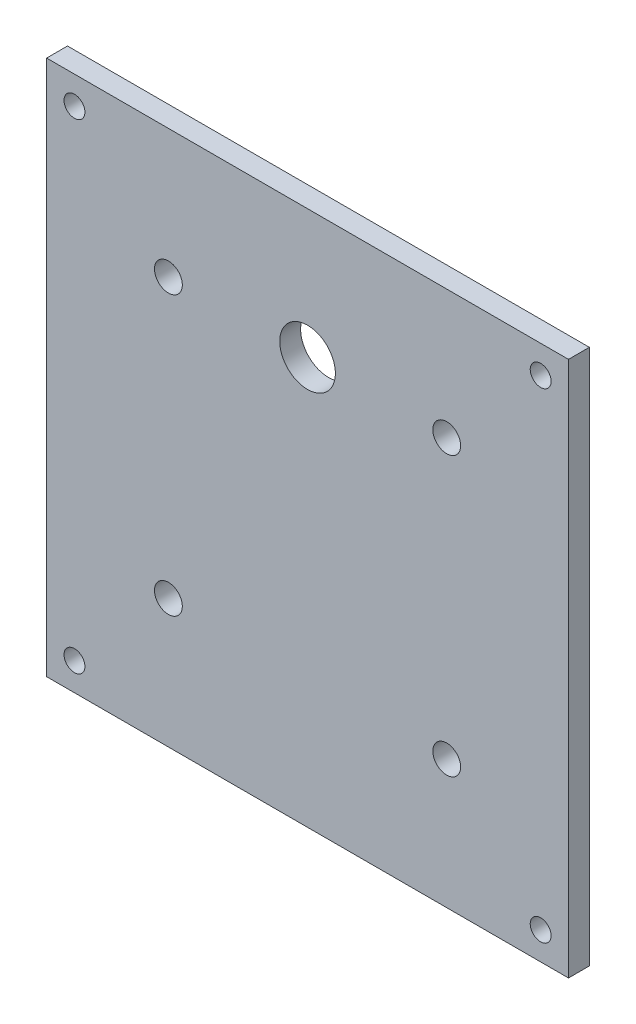
ISO-10303-21;
HEADER;
FILE_DESCRIPTION(('STEP AP214'),'2;1');
FILE_NAME('part.step','',(''),(''),'','','');
FILE_SCHEMA(('AUTOMOTIVE_DESIGN { 1 0 10303 214 1 1 1 1 }'));
ENDSEC;
DATA;
#1=APPLICATION_CONTEXT('core data for automotive mechanical design processes');
#2=APPLICATION_PROTOCOL_DEFINITION('international standard','automotive_design',2000,#1);
#3=PRODUCT_CONTEXT('',#1,'mechanical');
#4=PRODUCT('Part','Part','',(#3));
#5=PRODUCT_RELATED_PRODUCT_CATEGORY('part','',(#4));
#6=PRODUCT_DEFINITION_FORMATION('','',#4);
#7=PRODUCT_DEFINITION_CONTEXT('part definition',#1,'design');
#8=PRODUCT_DEFINITION('design','',#6,#7);
#9=PRODUCT_DEFINITION_SHAPE('','',#8);
#10=(LENGTH_UNIT() NAMED_UNIT(*) SI_UNIT(.MILLI.,.METRE.));
#11=(NAMED_UNIT(*) PLANE_ANGLE_UNIT() SI_UNIT($,.RADIAN.));
#12=(NAMED_UNIT(*) SI_UNIT($,.STERADIAN.) SOLID_ANGLE_UNIT());
#13=UNCERTAINTY_MEASURE_WITH_UNIT(LENGTH_MEASURE(1.E-05),#10,'distance_accuracy_value','');
#14=(GEOMETRIC_REPRESENTATION_CONTEXT(3) GLOBAL_UNCERTAINTY_ASSIGNED_CONTEXT((#13)) GLOBAL_UNIT_ASSIGNED_CONTEXT((#10,
#11,#12)) REPRESENTATION_CONTEXT('',''));
#15=CARTESIAN_POINT('',(0.,0.,0.));
#16=DIRECTION('',(0.,0.,1.));
#17=DIRECTION('',(1.,0.,0.));
#18=AXIS2_PLACEMENT_3D('',#15,#16,#17);
#19=CARTESIAN_POINT('',(0.,0.,3.));
#20=DIRECTION('',(0.,0.,-1.));
#21=DIRECTION('',(-1.,0.,0.));
#22=AXIS2_PLACEMENT_3D('',#19,#20,#21);
#23=PLANE('',#22);
#24=DIRECTION('',(0.,-1.,0.));
#25=VECTOR('',#24,1.);
#26=CARTESIAN_POINT('',(-63.1531531531532,-51.3828828828829,3.));
#27=LINE('',#26,#25);
#28=CARTESIAN_POINT('',(-63.1531531531532,25.6171171171171,3.));
#29=VERTEX_POINT('',#28);
#30=CARTESIAN_POINT('',(-63.1531531531532,-51.3828828828829,3.));
#31=VERTEX_POINT('',#30);
#32=EDGE_CURVE('E91',#29,#31,#27,.T.);
#33=ORIENTED_EDGE('',*,*,#32,.T.);
#34=DIRECTION('',(1.,0.,0.));
#35=VECTOR('',#34,1.);
#36=CARTESIAN_POINT('',(11.8468468468468,-51.3828828828829,3.));
#37=LINE('',#36,#35);
#38=CARTESIAN_POINT('',(11.8468468468468,-51.3828828828829,3.));
#39=VERTEX_POINT('',#38);
#40=EDGE_CURVE('E86',#31,#39,#37,.T.);
#41=ORIENTED_EDGE('',*,*,#40,.T.);
#42=DIRECTION('',(0.,1.,0.));
#43=VECTOR('',#42,1.);
#44=CARTESIAN_POINT('',(11.8468468468468,25.6171171171171,3.));
#45=LINE('',#44,#43);
#46=CARTESIAN_POINT('',(11.8468468468468,25.6171171171171,3.));
#47=VERTEX_POINT('',#46);
#48=EDGE_CURVE('E89',#39,#47,#45,.T.);
#49=ORIENTED_EDGE('',*,*,#48,.T.);
#50=DIRECTION('',(-1.,0.,0.));
#51=VECTOR('',#50,1.);
#52=CARTESIAN_POINT('',(-63.1531531531532,25.6171171171171,3.));
#53=LINE('',#52,#51);
#54=EDGE_CURVE('E56',#47,#29,#53,.T.);
#55=ORIENTED_EDGE('',*,*,#54,.T.);
#56=EDGE_LOOP('',(#33,#41,#49,#55));
#57=FACE_BOUND('',#56,.T.);
#58=CARTESIAN_POINT('',(-59.1531531531532,21.6171171171171,3.));
#59=DIRECTION('',(0.,0.,1.));
#60=DIRECTION('',(1.,0.,0.));
#61=AXIS2_PLACEMENT_3D('',#58,#59,#60);
#62=CIRCLE('',#61,1.5);
#63=CARTESIAN_POINT('',(-57.6531531531532,21.6171171171171,3.));
#64=VERTEX_POINT('',#63);
#65=EDGE_CURVE('E111',#64,#64,#62,.T.);
#66=ORIENTED_EDGE('',*,*,#65,.F.);
#67=EDGE_LOOP('',(#66));
#68=FACE_BOUND('',#67,.T.);
#69=CARTESIAN_POINT('',(7.84684684684683,21.6171171171171,3.));
#70=DIRECTION('',(0.,0.,1.));
#71=DIRECTION('',(1.,0.,0.));
#72=AXIS2_PLACEMENT_3D('',#69,#70,#71);
#73=CIRCLE('',#72,1.5);
#74=CARTESIAN_POINT('',(9.34684684684683,21.6171171171171,3.));
#75=VERTEX_POINT('',#74);
#76=EDGE_CURVE('E133',#75,#75,#73,.T.);
#77=ORIENTED_EDGE('',*,*,#76,.F.);
#78=EDGE_LOOP('',(#77));
#79=FACE_BOUND('',#78,.T.);
#80=CARTESIAN_POINT('',(-59.1531531531532,-47.3828828828829,3.));
#81=DIRECTION('',(0.,0.,1.));
#82=DIRECTION('',(1.,0.,0.));
#83=AXIS2_PLACEMENT_3D('',#80,#81,#82);
#84=CIRCLE('',#83,1.5);
#85=CARTESIAN_POINT('',(-57.6531531531532,-47.3828828828829,3.));
#86=VERTEX_POINT('',#85);
#87=EDGE_CURVE('E141',#86,#86,#84,.T.);
#88=ORIENTED_EDGE('',*,*,#87,.F.);
#89=EDGE_LOOP('',(#88));
#90=FACE_BOUND('',#89,.T.);
#91=CARTESIAN_POINT('',(7.84684684684683,-47.3828828828829,3.));
#92=DIRECTION('',(0.,0.,1.));
#93=DIRECTION('',(1.,0.,0.));
#94=AXIS2_PLACEMENT_3D('',#91,#92,#93);
#95=CIRCLE('',#94,1.5);
#96=CARTESIAN_POINT('',(9.34684684684683,-47.3828828828829,3.));
#97=VERTEX_POINT('',#96);
#98=EDGE_CURVE('E149',#97,#97,#95,.T.);
#99=ORIENTED_EDGE('',*,*,#98,.F.);
#100=EDGE_LOOP('',(#99));
#101=FACE_BOUND('',#100,.T.);
#102=CARTESIAN_POINT('',(-5.65315315315317,-32.8828828828829,3.));
#103=DIRECTION('',(0.,0.,1.));
#104=DIRECTION('',(1.,0.,0.));
#105=AXIS2_PLACEMENT_3D('',#102,#103,#104);
#106=CIRCLE('',#105,2.);
#107=CARTESIAN_POINT('',(-3.65315315315317,-32.8828828828829,3.));
#108=VERTEX_POINT('',#107);
#109=EDGE_CURVE('E157',#108,#108,#106,.T.);
#110=ORIENTED_EDGE('',*,*,#109,.F.);
#111=EDGE_LOOP('',(#110));
#112=FACE_BOUND('',#111,.T.);
#113=CARTESIAN_POINT('',(-25.653153153153,7.11711711711709,3.));
#114=DIRECTION('',(0.,0.,1.));
#115=DIRECTION('',(1.,0.,0.));
#116=AXIS2_PLACEMENT_3D('',#113,#114,#115);
#117=CIRCLE('',#116,4.);
#118=CARTESIAN_POINT('',(-21.653153153153,7.11711711711709,3.));
#119=VERTEX_POINT('',#118);
#120=EDGE_CURVE('E165',#119,#119,#117,.T.);
#121=ORIENTED_EDGE('',*,*,#120,.F.);
#122=EDGE_LOOP('',(#121));
#123=FACE_BOUND('',#122,.T.);
#124=CARTESIAN_POINT('',(-45.6531531531533,-32.8828828828828,3.));
#125=DIRECTION('',(0.,0.,1.));
#126=DIRECTION('',(1.,0.,0.));
#127=AXIS2_PLACEMENT_3D('',#124,#125,#126);
#128=CIRCLE('',#127,2.);
#129=CARTESIAN_POINT('',(-43.6531531531533,-32.8828828828828,3.));
#130=VERTEX_POINT('',#129);
#131=EDGE_CURVE('E173',#130,#130,#128,.T.);
#132=ORIENTED_EDGE('',*,*,#131,.F.);
#133=EDGE_LOOP('',(#132));
#134=FACE_BOUND('',#133,.T.);
#135=CARTESIAN_POINT('',(-45.6531531531531,7.11711711711726,3.));
#136=DIRECTION('',(0.,0.,1.));
#137=DIRECTION('',(1.,0.,0.));
#138=AXIS2_PLACEMENT_3D('',#135,#136,#137);
#139=CIRCLE('',#138,2.00000000000001);
#140=CARTESIAN_POINT('',(-43.6531531531531,7.11711711711726,3.));
#141=VERTEX_POINT('',#140);
#142=EDGE_CURVE('E181',#141,#141,#139,.T.);
#143=ORIENTED_EDGE('',*,*,#142,.F.);
#144=EDGE_LOOP('',(#143));
#145=FACE_BOUND('',#144,.T.);
#146=CARTESIAN_POINT('',(-5.65315315315298,7.11711711711692,3.));
#147=DIRECTION('',(0.,0.,1.));
#148=DIRECTION('',(1.,0.,0.));
#149=AXIS2_PLACEMENT_3D('',#146,#147,#148);
#150=CIRCLE('',#149,2.);
#151=CARTESIAN_POINT('',(-3.65315315315298,7.11711711711692,3.));
#152=VERTEX_POINT('',#151);
#153=EDGE_CURVE('E189',#152,#152,#150,.T.);
#154=ORIENTED_EDGE('',*,*,#153,.F.);
#155=EDGE_LOOP('',(#154));
#156=FACE_BOUND('',#155,.T.);
#157=ADVANCED_FACE('F38',(#57,#68,#79,#90,#101,#112,#123,#134,#145,#156),#23,.F.);
#158=CARTESIAN_POINT('',(0.,0.,0.));
#159=DIRECTION('',(0.,0.,-1.));
#160=DIRECTION('',(-1.,0.,0.));
#161=AXIS2_PLACEMENT_3D('',#158,#159,#160);
#162=PLANE('',#161);
#163=CARTESIAN_POINT('',(-45.6531531531531,7.11711711711726,0.));
#164=DIRECTION('',(0.,0.,1.));
#165=DIRECTION('',(1.,0.,0.));
#166=AXIS2_PLACEMENT_3D('',#163,#164,#165);
#167=CIRCLE('',#166,2.00000000000001);
#168=CARTESIAN_POINT('',(-43.6531531531531,7.11711711711726,0.));
#169=VERTEX_POINT('',#168);
#170=EDGE_CURVE('E185',#169,#169,#167,.T.);
#171=ORIENTED_EDGE('',*,*,#170,.T.);
#172=EDGE_LOOP('',(#171));
#173=FACE_BOUND('',#172,.T.);
#174=CARTESIAN_POINT('',(-25.653153153153,7.11711711711709,0.));
#175=DIRECTION('',(0.,0.,1.));
#176=DIRECTION('',(1.,0.,0.));
#177=AXIS2_PLACEMENT_3D('',#174,#175,#176);
#178=CIRCLE('',#177,4.);
#179=CARTESIAN_POINT('',(-21.653153153153,7.11711711711709,0.));
#180=VERTEX_POINT('',#179);
#181=EDGE_CURVE('E169',#180,#180,#178,.T.);
#182=ORIENTED_EDGE('',*,*,#181,.T.);
#183=EDGE_LOOP('',(#182));
#184=FACE_BOUND('',#183,.T.);
#185=CARTESIAN_POINT('',(7.84684684684683,-47.3828828828829,0.));
#186=DIRECTION('',(0.,0.,1.));
#187=DIRECTION('',(1.,0.,0.));
#188=AXIS2_PLACEMENT_3D('',#185,#186,#187);
#189=CIRCLE('',#188,1.5);
#190=CARTESIAN_POINT('',(9.34684684684683,-47.3828828828829,0.));
#191=VERTEX_POINT('',#190);
#192=EDGE_CURVE('E153',#191,#191,#189,.T.);
#193=ORIENTED_EDGE('',*,*,#192,.T.);
#194=EDGE_LOOP('',(#193));
#195=FACE_BOUND('',#194,.T.);
#196=CARTESIAN_POINT('',(7.84684684684683,21.6171171171171,0.));
#197=DIRECTION('',(0.,0.,1.));
#198=DIRECTION('',(1.,0.,0.));
#199=AXIS2_PLACEMENT_3D('',#196,#197,#198);
#200=CIRCLE('',#199,1.5);
#201=CARTESIAN_POINT('',(9.34684684684683,21.6171171171171,0.));
#202=VERTEX_POINT('',#201);
#203=EDGE_CURVE('E137',#202,#202,#200,.T.);
#204=ORIENTED_EDGE('',*,*,#203,.T.);
#205=EDGE_LOOP('',(#204));
#206=FACE_BOUND('',#205,.T.);
#207=DIRECTION('',(0.,-1.,0.));
#208=VECTOR('',#207,1.);
#209=CARTESIAN_POINT('',(-63.1531531531532,-51.3828828828829,0.));
#210=LINE('',#209,#208);
#211=CARTESIAN_POINT('',(-63.1531531531532,25.6171171171171,0.));
#212=VERTEX_POINT('',#211);
#213=CARTESIAN_POINT('',(-63.1531531531532,-51.3828828828829,0.));
#214=VERTEX_POINT('',#213);
#215=EDGE_CURVE('E107',#212,#214,#210,.T.);
#216=ORIENTED_EDGE('',*,*,#215,.F.);
#217=DIRECTION('',(-1.,0.,0.));
#218=VECTOR('',#217,1.);
#219=CARTESIAN_POINT('',(-63.1531531531532,25.6171171171171,0.));
#220=LINE('',#219,#218);
#221=CARTESIAN_POINT('',(11.8468468468468,25.6171171171171,0.));
#222=VERTEX_POINT('',#221);
#223=EDGE_CURVE('E79',#222,#212,#220,.T.);
#224=ORIENTED_EDGE('',*,*,#223,.F.);
#225=DIRECTION('',(0.,1.,0.));
#226=VECTOR('',#225,1.);
#227=CARTESIAN_POINT('',(11.8468468468468,25.6171171171171,0.));
#228=LINE('',#227,#226);
#229=CARTESIAN_POINT('',(11.8468468468468,-51.3828828828829,0.));
#230=VERTEX_POINT('',#229);
#231=EDGE_CURVE('E73',#230,#222,#228,.T.);
#232=ORIENTED_EDGE('',*,*,#231,.F.);
#233=DIRECTION('',(1.,0.,0.));
#234=VECTOR('',#233,1.);
#235=CARTESIAN_POINT('',(11.8468468468468,-51.3828828828829,0.));
#236=LINE('',#235,#234);
#237=EDGE_CURVE('E96',#214,#230,#236,.T.);
#238=ORIENTED_EDGE('',*,*,#237,.F.);
#239=EDGE_LOOP('',(#216,#224,#232,#238));
#240=FACE_BOUND('',#239,.T.);
#241=CARTESIAN_POINT('',(-59.1531531531532,21.6171171171171,0.));
#242=DIRECTION('',(0.,0.,1.));
#243=DIRECTION('',(1.,0.,0.));
#244=AXIS2_PLACEMENT_3D('',#241,#242,#243);
#245=CIRCLE('',#244,1.5);
#246=CARTESIAN_POINT('',(-57.6531531531532,21.6171171171171,0.));
#247=VERTEX_POINT('',#246);
#248=EDGE_CURVE('E129',#247,#247,#245,.T.);
#249=ORIENTED_EDGE('',*,*,#248,.T.);
#250=EDGE_LOOP('',(#249));
#251=FACE_BOUND('',#250,.T.);
#252=CARTESIAN_POINT('',(-59.1531531531532,-47.3828828828829,0.));
#253=DIRECTION('',(0.,0.,1.));
#254=DIRECTION('',(1.,0.,0.));
#255=AXIS2_PLACEMENT_3D('',#252,#253,#254);
#256=CIRCLE('',#255,1.5);
#257=CARTESIAN_POINT('',(-57.6531531531532,-47.3828828828829,0.));
#258=VERTEX_POINT('',#257);
#259=EDGE_CURVE('E145',#258,#258,#256,.T.);
#260=ORIENTED_EDGE('',*,*,#259,.T.);
#261=EDGE_LOOP('',(#260));
#262=FACE_BOUND('',#261,.T.);
#263=CARTESIAN_POINT('',(-5.65315315315317,-32.8828828828829,0.));
#264=DIRECTION('',(0.,0.,1.));
#265=DIRECTION('',(1.,0.,0.));
#266=AXIS2_PLACEMENT_3D('',#263,#264,#265);
#267=CIRCLE('',#266,2.);
#268=CARTESIAN_POINT('',(-3.65315315315317,-32.8828828828829,0.));
#269=VERTEX_POINT('',#268);
#270=EDGE_CURVE('E161',#269,#269,#267,.T.);
#271=ORIENTED_EDGE('',*,*,#270,.T.);
#272=EDGE_LOOP('',(#271));
#273=FACE_BOUND('',#272,.T.);
#274=CARTESIAN_POINT('',(-45.6531531531533,-32.8828828828828,0.));
#275=DIRECTION('',(0.,0.,1.));
#276=DIRECTION('',(1.,0.,0.));
#277=AXIS2_PLACEMENT_3D('',#274,#275,#276);
#278=CIRCLE('',#277,2.);
#279=CARTESIAN_POINT('',(-43.6531531531533,-32.8828828828828,0.));
#280=VERTEX_POINT('',#279);
#281=EDGE_CURVE('E177',#280,#280,#278,.T.);
#282=ORIENTED_EDGE('',*,*,#281,.T.);
#283=EDGE_LOOP('',(#282));
#284=FACE_BOUND('',#283,.T.);
#285=CARTESIAN_POINT('',(-5.65315315315298,7.11711711711692,0.));
#286=DIRECTION('',(0.,0.,1.));
#287=DIRECTION('',(1.,0.,0.));
#288=AXIS2_PLACEMENT_3D('',#285,#286,#287);
#289=CIRCLE('',#288,2.);
#290=CARTESIAN_POINT('',(-3.65315315315298,7.11711711711692,0.));
#291=VERTEX_POINT('',#290);
#292=EDGE_CURVE('E193',#291,#291,#289,.T.);
#293=ORIENTED_EDGE('',*,*,#292,.T.);
#294=EDGE_LOOP('',(#293));
#295=FACE_BOUND('',#294,.T.);
#296=ADVANCED_FACE('F124',(#173,#184,#195,#206,#240,#251,#262,#273,#284,#295),#162,.T.);
#297=CARTESIAN_POINT('',(-63.1531531531532,-51.3828828828829,3.));
#298=DIRECTION('',(1.,0.,0.));
#299=DIRECTION('',(0.,0.,-1.));
#300=AXIS2_PLACEMENT_3D('',#297,#298,#299);
#301=PLANE('',#300);
#302=ORIENTED_EDGE('',*,*,#215,.T.);
#303=DIRECTION('',(0.,0.,-1.));
#304=VECTOR('',#303,1.);
#305=CARTESIAN_POINT('',(-63.1531531531532,-51.3828828828829,3.));
#306=LINE('',#305,#304);
#307=EDGE_CURVE('E11',#31,#214,#306,.T.);
#308=ORIENTED_EDGE('',*,*,#307,.F.);
#309=ORIENTED_EDGE('',*,*,#32,.F.);
#310=DIRECTION('',(0.,0.,-1.));
#311=VECTOR('',#310,1.);
#312=CARTESIAN_POINT('',(-63.1531531531532,25.6171171171171,3.));
#313=LINE('',#312,#311);
#314=EDGE_CURVE('E103',#29,#212,#313,.T.);
#315=ORIENTED_EDGE('',*,*,#314,.T.);
#316=EDGE_LOOP('',(#302,#308,#309,#315));
#317=FACE_BOUND('',#316,.T.);
#318=ADVANCED_FACE('F40',(#317),#301,.F.);
#319=CARTESIAN_POINT('',(11.8468468468468,-51.3828828828829,3.));
#320=DIRECTION('',(0.,1.,0.));
#321=DIRECTION('',(0.,0.,1.));
#322=AXIS2_PLACEMENT_3D('',#319,#320,#321);
#323=PLANE('',#322);
#324=ORIENTED_EDGE('',*,*,#237,.T.);
#325=DIRECTION('',(0.,0.,-1.));
#326=VECTOR('',#325,1.);
#327=CARTESIAN_POINT('',(11.8468468468468,-51.3828828828829,3.));
#328=LINE('',#327,#326);
#329=EDGE_CURVE('E48',#39,#230,#328,.T.);
#330=ORIENTED_EDGE('',*,*,#329,.F.);
#331=ORIENTED_EDGE('',*,*,#40,.F.);
#332=ORIENTED_EDGE('',*,*,#307,.T.);
#333=EDGE_LOOP('',(#324,#330,#331,#332));
#334=FACE_BOUND('',#333,.T.);
#335=ADVANCED_FACE('F95',(#334),#323,.F.);
#336=CARTESIAN_POINT('',(11.8468468468468,25.6171171171171,3.));
#337=DIRECTION('',(-1.,0.,0.));
#338=DIRECTION('',(0.,0.,1.));
#339=AXIS2_PLACEMENT_3D('',#336,#337,#338);
#340=PLANE('',#339);
#341=ORIENTED_EDGE('',*,*,#231,.T.);
#342=DIRECTION('',(0.,0.,-1.));
#343=VECTOR('',#342,1.);
#344=CARTESIAN_POINT('',(11.8468468468468,25.6171171171171,3.));
#345=LINE('',#344,#343);
#346=EDGE_CURVE('E98',#47,#222,#345,.T.);
#347=ORIENTED_EDGE('',*,*,#346,.F.);
#348=ORIENTED_EDGE('',*,*,#48,.F.);
#349=ORIENTED_EDGE('',*,*,#329,.T.);
#350=EDGE_LOOP('',(#341,#347,#348,#349));
#351=FACE_BOUND('',#350,.T.);
#352=ADVANCED_FACE('F99',(#351),#340,.F.);
#353=CARTESIAN_POINT('',(-63.1531531531532,25.6171171171171,3.));
#354=DIRECTION('',(0.,-1.,0.));
#355=DIRECTION('',(0.,0.,-1.));
#356=AXIS2_PLACEMENT_3D('',#353,#354,#355);
#357=PLANE('',#356);
#358=ORIENTED_EDGE('',*,*,#223,.T.);
#359=ORIENTED_EDGE('',*,*,#314,.F.);
#360=ORIENTED_EDGE('',*,*,#54,.F.);
#361=ORIENTED_EDGE('',*,*,#346,.T.);
#362=EDGE_LOOP('',(#358,#359,#360,#361));
#363=FACE_BOUND('',#362,.T.);
#364=ADVANCED_FACE('F121',(#363),#357,.F.);
#365=CARTESIAN_POINT('',(-59.1531531531532,21.6171171171171,3.));
#366=DIRECTION('',(0.,0.,-1.));
#367=DIRECTION('',(-1.,0.,0.));
#368=AXIS2_PLACEMENT_3D('',#365,#366,#367);
#369=CYLINDRICAL_SURFACE('',#368,1.5);
#370=ORIENTED_EDGE('',*,*,#65,.T.);
#371=EDGE_LOOP('',(#370));
#372=FACE_BOUND('',#371,.T.);
#373=ORIENTED_EDGE('',*,*,#248,.F.);
#374=EDGE_LOOP('',(#373));
#375=FACE_BOUND('',#374,.T.);
#376=ADVANCED_FACE('F212',(#372,#375),#369,.F.);
#377=CARTESIAN_POINT('',(7.84684684684683,21.6171171171171,3.));
#378=DIRECTION('',(0.,0.,-1.));
#379=DIRECTION('',(-1.,0.,0.));
#380=AXIS2_PLACEMENT_3D('',#377,#378,#379);
#381=CYLINDRICAL_SURFACE('',#380,1.5);
#382=ORIENTED_EDGE('',*,*,#76,.T.);
#383=EDGE_LOOP('',(#382));
#384=FACE_BOUND('',#383,.T.);
#385=ORIENTED_EDGE('',*,*,#203,.F.);
#386=EDGE_LOOP('',(#385));
#387=FACE_BOUND('',#386,.T.);
#388=ADVANCED_FACE('F258',(#384,#387),#381,.F.);
#389=CARTESIAN_POINT('',(-59.1531531531532,-47.3828828828829,3.));
#390=DIRECTION('',(0.,0.,-1.));
#391=DIRECTION('',(-1.,0.,0.));
#392=AXIS2_PLACEMENT_3D('',#389,#390,#391);
#393=CYLINDRICAL_SURFACE('',#392,1.5);
#394=ORIENTED_EDGE('',*,*,#87,.T.);
#395=EDGE_LOOP('',(#394));
#396=FACE_BOUND('',#395,.T.);
#397=ORIENTED_EDGE('',*,*,#259,.F.);
#398=EDGE_LOOP('',(#397));
#399=FACE_BOUND('',#398,.T.);
#400=ADVANCED_FACE('F266',(#396,#399),#393,.F.);
#401=CARTESIAN_POINT('',(7.84684684684683,-47.3828828828829,3.));
#402=DIRECTION('',(0.,0.,-1.));
#403=DIRECTION('',(-1.,0.,0.));
#404=AXIS2_PLACEMENT_3D('',#401,#402,#403);
#405=CYLINDRICAL_SURFACE('',#404,1.5);
#406=ORIENTED_EDGE('',*,*,#98,.T.);
#407=EDGE_LOOP('',(#406));
#408=FACE_BOUND('',#407,.T.);
#409=ORIENTED_EDGE('',*,*,#192,.F.);
#410=EDGE_LOOP('',(#409));
#411=FACE_BOUND('',#410,.T.);
#412=ADVANCED_FACE('F274',(#408,#411),#405,.F.);
#413=CARTESIAN_POINT('',(-5.65315315315317,-32.8828828828829,3.));
#414=DIRECTION('',(0.,0.,-1.));
#415=DIRECTION('',(-1.,0.,0.));
#416=AXIS2_PLACEMENT_3D('',#413,#414,#415);
#417=CYLINDRICAL_SURFACE('',#416,2.);
#418=ORIENTED_EDGE('',*,*,#109,.T.);
#419=EDGE_LOOP('',(#418));
#420=FACE_BOUND('',#419,.T.);
#421=ORIENTED_EDGE('',*,*,#270,.F.);
#422=EDGE_LOOP('',(#421));
#423=FACE_BOUND('',#422,.T.);
#424=ADVANCED_FACE('F283',(#420,#423),#417,.F.);
#425=CARTESIAN_POINT('',(-25.653153153153,7.11711711711709,3.));
#426=DIRECTION('',(0.,0.,-1.));
#427=DIRECTION('',(-1.,0.,0.));
#428=AXIS2_PLACEMENT_3D('',#425,#426,#427);
#429=CYLINDRICAL_SURFACE('',#428,4.);
#430=ORIENTED_EDGE('',*,*,#120,.T.);
#431=EDGE_LOOP('',(#430));
#432=FACE_BOUND('',#431,.T.);
#433=ORIENTED_EDGE('',*,*,#181,.F.);
#434=EDGE_LOOP('',(#433));
#435=FACE_BOUND('',#434,.T.);
#436=ADVANCED_FACE('F292',(#432,#435),#429,.F.);
#437=CARTESIAN_POINT('',(-45.6531531531533,-32.8828828828828,3.));
#438=DIRECTION('',(0.,0.,-1.));
#439=DIRECTION('',(-1.,0.,0.));
#440=AXIS2_PLACEMENT_3D('',#437,#438,#439);
#441=CYLINDRICAL_SURFACE('',#440,2.);
#442=ORIENTED_EDGE('',*,*,#131,.T.);
#443=EDGE_LOOP('',(#442));
#444=FACE_BOUND('',#443,.T.);
#445=ORIENTED_EDGE('',*,*,#281,.F.);
#446=EDGE_LOOP('',(#445));
#447=FACE_BOUND('',#446,.T.);
#448=ADVANCED_FACE('F301',(#444,#447),#441,.F.);
#449=CARTESIAN_POINT('',(-45.6531531531531,7.11711711711726,3.));
#450=DIRECTION('',(0.,0.,-1.));
#451=DIRECTION('',(-1.,0.,0.));
#452=AXIS2_PLACEMENT_3D('',#449,#450,#451);
#453=CYLINDRICAL_SURFACE('',#452,2.00000000000001);
#454=ORIENTED_EDGE('',*,*,#142,.T.);
#455=EDGE_LOOP('',(#454));
#456=FACE_BOUND('',#455,.T.);
#457=ORIENTED_EDGE('',*,*,#170,.F.);
#458=EDGE_LOOP('',(#457));
#459=FACE_BOUND('',#458,.T.);
#460=ADVANCED_FACE('F310',(#456,#459),#453,.F.);
#461=CARTESIAN_POINT('',(-5.65315315315298,7.11711711711692,3.));
#462=DIRECTION('',(0.,0.,-1.));
#463=DIRECTION('',(-1.,0.,0.));
#464=AXIS2_PLACEMENT_3D('',#461,#462,#463);
#465=CYLINDRICAL_SURFACE('',#464,2.);
#466=ORIENTED_EDGE('',*,*,#153,.T.);
#467=EDGE_LOOP('',(#466));
#468=FACE_BOUND('',#467,.T.);
#469=ORIENTED_EDGE('',*,*,#292,.F.);
#470=EDGE_LOOP('',(#469));
#471=FACE_BOUND('',#470,.T.);
#472=ADVANCED_FACE('F201',(#468,#471),#465,.F.);
#473=CLOSED_SHELL('',(#157,#296,#318,#335,#352,#364,#376,#388,#400,#412,#424,#436,#448,#460,#472));
#474=MANIFOLD_SOLID_BREP('B2',#473);
#475=ADVANCED_BREP_SHAPE_REPRESENTATION('',(#18,#474),#14);
#476=SHAPE_DEFINITION_REPRESENTATION(#9,#475);
ENDSEC;
END-ISO-10303-21;
